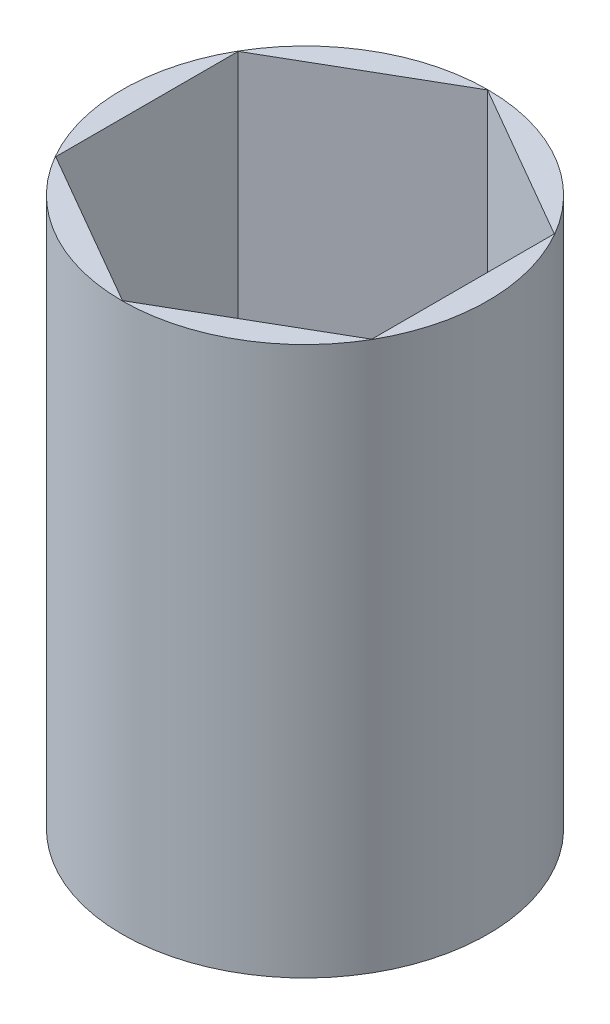
ISO-10303-21;
HEADER;
FILE_DESCRIPTION(('STEP AP214'),'2;1');
FILE_NAME('part.step','',(''),(''),'','','');
FILE_SCHEMA(('AUTOMOTIVE_DESIGN { 1 0 10303 214 1 1 1 1 }'));
ENDSEC;
DATA;
#1=APPLICATION_CONTEXT('core data for automotive mechanical design processes');
#2=APPLICATION_PROTOCOL_DEFINITION('international standard','automotive_design',2000,#1);
#3=PRODUCT_CONTEXT('',#1,'mechanical');
#4=PRODUCT('Part','Part','',(#3));
#5=PRODUCT_RELATED_PRODUCT_CATEGORY('part','',(#4));
#6=PRODUCT_DEFINITION_FORMATION('','',#4);
#7=PRODUCT_DEFINITION_CONTEXT('part definition',#1,'design');
#8=PRODUCT_DEFINITION('design','',#6,#7);
#9=PRODUCT_DEFINITION_SHAPE('','',#8);
#10=(LENGTH_UNIT() NAMED_UNIT(*) SI_UNIT(.MILLI.,.METRE.));
#11=(NAMED_UNIT(*) PLANE_ANGLE_UNIT() SI_UNIT($,.RADIAN.));
#12=(NAMED_UNIT(*) SI_UNIT($,.STERADIAN.) SOLID_ANGLE_UNIT());
#13=UNCERTAINTY_MEASURE_WITH_UNIT(LENGTH_MEASURE(1.E-05),#10,'distance_accuracy_value','');
#14=(GEOMETRIC_REPRESENTATION_CONTEXT(3) GLOBAL_UNCERTAINTY_ASSIGNED_CONTEXT((#13)) GLOBAL_UNIT_ASSIGNED_CONTEXT((#10,
#11,#12)) REPRESENTATION_CONTEXT('',''));
#15=CARTESIAN_POINT('',(0.,0.,0.));
#16=DIRECTION('',(0.,0.,1.));
#17=DIRECTION('',(1.,0.,0.));
#18=AXIS2_PLACEMENT_3D('',#15,#16,#17);
#19=CARTESIAN_POINT('',(0.,20.,0.));
#20=DIRECTION('',(0.,1.,0.));
#21=DIRECTION('',(0.,0.,1.));
#22=AXIS2_PLACEMENT_3D('',#19,#20,#21);
#23=PLANE('',#22);
#24=CARTESIAN_POINT('',(0.,20.,0.));
#25=DIRECTION('',(0.,1.,0.));
#26=DIRECTION('',(0.,0.,1.));
#27=AXIS2_PLACEMENT_3D('',#24,#25,#26);
#28=CIRCLE('',#27,7.);
#29=CARTESIAN_POINT('',(0.,20.,7.));
#30=VERTEX_POINT('',#29);
#31=EDGE_CURVE('E11',#30,#30,#28,.T.);
#32=ORIENTED_EDGE('',*,*,#31,.T.);
#33=EDGE_LOOP('',(#32));
#34=FACE_BOUND('',#33,.T.);
#35=DIRECTION('',(-0.866025403784438,0.,0.5));
#36=VECTOR('',#35,1.);
#37=CARTESIAN_POINT('',(0.,20.,-6.98593825719447));
#38=LINE('',#37,#36);
#39=CARTESIAN_POINT('',(0.,20.,-6.98593825719447));
#40=VERTEX_POINT('',#39);
#41=CARTESIAN_POINT('',(-6.05,20.,-3.49296912859724));
#42=VERTEX_POINT('',#41);
#43=EDGE_CURVE('E111',#40,#42,#38,.T.);
#44=ORIENTED_EDGE('',*,*,#43,.F.);
#45=DIRECTION('',(-0.866025403784439,0.,-0.5));
#46=VECTOR('',#45,1.);
#47=CARTESIAN_POINT('',(6.05,20.,-3.49296912859724));
#48=LINE('',#47,#46);
#49=CARTESIAN_POINT('',(6.05,20.,-3.49296912859724));
#50=VERTEX_POINT('',#49);
#51=EDGE_CURVE('E90',#50,#40,#48,.T.);
#52=ORIENTED_EDGE('',*,*,#51,.F.);
#53=DIRECTION('',(0.,0.,-1.));
#54=VECTOR('',#53,1.);
#55=CARTESIAN_POINT('',(6.05,20.,3.49296912859724));
#56=LINE('',#55,#54);
#57=CARTESIAN_POINT('',(6.05,20.,3.49296912859724));
#58=VERTEX_POINT('',#57);
#59=EDGE_CURVE('E61',#58,#50,#56,.T.);
#60=ORIENTED_EDGE('',*,*,#59,.F.);
#61=DIRECTION('',(0.866025403784439,0.,-0.5));
#62=VECTOR('',#61,1.);
#63=CARTESIAN_POINT('',(0.,20.,6.98593825719447));
#64=LINE('',#63,#62);
#65=CARTESIAN_POINT('',(0.,20.,6.98593825719447));
#66=VERTEX_POINT('',#65);
#67=EDGE_CURVE('E123',#66,#58,#64,.T.);
#68=ORIENTED_EDGE('',*,*,#67,.F.);
#69=DIRECTION('',(0.866025403784438,0.,0.5));
#70=VECTOR('',#69,1.);
#71=CARTESIAN_POINT('',(-6.05,20.,3.49296912859723));
#72=LINE('',#71,#70);
#73=CARTESIAN_POINT('',(-6.05,20.,3.49296912859723));
#74=VERTEX_POINT('',#73);
#75=EDGE_CURVE('E110',#74,#66,#72,.T.);
#76=ORIENTED_EDGE('',*,*,#75,.F.);
#77=DIRECTION('',(0.,0.,1.));
#78=VECTOR('',#77,1.);
#79=CARTESIAN_POINT('',(-6.05,20.,-3.49296912859724));
#80=LINE('',#79,#78);
#81=EDGE_CURVE('E99',#42,#74,#80,.T.);
#82=ORIENTED_EDGE('',*,*,#81,.F.);
#83=EDGE_LOOP('',(#44,#52,#60,#68,#76,#82));
#84=FACE_BOUND('',#83,.T.);
#85=ADVANCED_FACE('F39',(#34,#84),#23,.T.);
#86=CARTESIAN_POINT('',(0.,20.,0.));
#87=DIRECTION('',(0.,-1.,0.));
#88=DIRECTION('',(0.,0.,-1.));
#89=AXIS2_PLACEMENT_3D('',#86,#87,#88);
#90=CYLINDRICAL_SURFACE('',#89,7.);
#91=ORIENTED_EDGE('',*,*,#31,.F.);
#92=EDGE_LOOP('',(#91));
#93=FACE_BOUND('',#92,.T.);
#94=CARTESIAN_POINT('',(0.,-1.,0.));
#95=DIRECTION('',(0.,-1.,0.));
#96=DIRECTION('',(0.,0.,-1.));
#97=AXIS2_PLACEMENT_3D('',#94,#95,#96);
#98=CIRCLE('',#97,7.);
#99=CARTESIAN_POINT('',(0.,-1.,-7.));
#100=VERTEX_POINT('',#99);
#101=EDGE_CURVE('E138',#100,#100,#98,.T.);
#102=ORIENTED_EDGE('',*,*,#101,.F.);
#103=EDGE_LOOP('',(#102));
#104=FACE_BOUND('',#103,.T.);
#105=ADVANCED_FACE('F41',(#93,#104),#90,.T.);
#106=CARTESIAN_POINT('',(6.05,20.,-3.49296912859724));
#107=DIRECTION('',(-0.5,0.,0.866025403784439));
#108=DIRECTION('',(0.866025403784439,0.,0.5));
#109=AXIS2_PLACEMENT_3D('',#106,#107,#108);
#110=PLANE('',#109);
#111=DIRECTION('',(-0.866025403784439,0.,-0.5));
#112=VECTOR('',#111,1.);
#113=CARTESIAN_POINT('',(6.05,0.,-3.49296912859724));
#114=LINE('',#113,#112);
#115=CARTESIAN_POINT('',(6.05,0.,-3.49296912859724));
#116=VERTEX_POINT('',#115);
#117=CARTESIAN_POINT('',(0.,0.,-6.98593825719447));
#118=VERTEX_POINT('',#117);
#119=EDGE_CURVE('E133',#116,#118,#114,.T.);
#120=ORIENTED_EDGE('',*,*,#119,.F.);
#121=DIRECTION('',(0.,-1.,0.));
#122=VECTOR('',#121,1.);
#123=CARTESIAN_POINT('',(6.05,20.,-3.49296912859724));
#124=LINE('',#123,#122);
#125=EDGE_CURVE('E132',#50,#116,#124,.T.);
#126=ORIENTED_EDGE('',*,*,#125,.F.);
#127=ORIENTED_EDGE('',*,*,#51,.T.);
#128=DIRECTION('',(0.,-1.,0.));
#129=VECTOR('',#128,1.);
#130=CARTESIAN_POINT('',(0.,20.,-6.98593825719447));
#131=LINE('',#130,#129);
#132=EDGE_CURVE('E48',#40,#118,#131,.T.);
#133=ORIENTED_EDGE('',*,*,#132,.T.);
#134=EDGE_LOOP('',(#120,#126,#127,#133));
#135=FACE_BOUND('',#134,.T.);
#136=ADVANCED_FACE('F164',(#135),#110,.T.);
#137=CARTESIAN_POINT('',(0.,20.,-6.98593825719447));
#138=DIRECTION('',(0.5,0.,0.866025403784438));
#139=DIRECTION('',(0.866025403784439,0.,-0.5));
#140=AXIS2_PLACEMENT_3D('',#137,#138,#139);
#141=PLANE('',#140);
#142=DIRECTION('',(-0.866025403784438,0.,0.5));
#143=VECTOR('',#142,1.);
#144=CARTESIAN_POINT('',(0.,0.,-6.98593825719447));
#145=LINE('',#144,#143);
#146=CARTESIAN_POINT('',(-6.05,0.,-3.49296912859724));
#147=VERTEX_POINT('',#146);
#148=EDGE_CURVE('E137',#118,#147,#145,.T.);
#149=ORIENTED_EDGE('',*,*,#148,.F.);
#150=ORIENTED_EDGE('',*,*,#132,.F.);
#151=ORIENTED_EDGE('',*,*,#43,.T.);
#152=DIRECTION('',(0.,-1.,0.));
#153=VECTOR('',#152,1.);
#154=CARTESIAN_POINT('',(-6.05,20.,-3.49296912859724));
#155=LINE('',#154,#153);
#156=EDGE_CURVE('E105',#42,#147,#155,.T.);
#157=ORIENTED_EDGE('',*,*,#156,.T.);
#158=EDGE_LOOP('',(#149,#150,#151,#157));
#159=FACE_BOUND('',#158,.T.);
#160=ADVANCED_FACE('F208',(#159),#141,.T.);
#161=CARTESIAN_POINT('',(-6.05,20.,-3.49296912859724));
#162=DIRECTION('',(1.,0.,0.));
#163=DIRECTION('',(0.,0.,-1.));
#164=AXIS2_PLACEMENT_3D('',#161,#162,#163);
#165=PLANE('',#164);
#166=DIRECTION('',(0.,0.,1.));
#167=VECTOR('',#166,1.);
#168=CARTESIAN_POINT('',(-6.05,0.,-3.49296912859724));
#169=LINE('',#168,#167);
#170=CARTESIAN_POINT('',(-6.05,0.,3.49296912859723));
#171=VERTEX_POINT('',#170);
#172=EDGE_CURVE('E142',#147,#171,#169,.T.);
#173=ORIENTED_EDGE('',*,*,#172,.F.);
#174=ORIENTED_EDGE('',*,*,#156,.F.);
#175=ORIENTED_EDGE('',*,*,#81,.T.);
#176=DIRECTION('',(0.,-1.,0.));
#177=VECTOR('',#176,1.);
#178=CARTESIAN_POINT('',(-6.05,20.,3.49296912859723));
#179=LINE('',#178,#177);
#180=EDGE_CURVE('E103',#74,#171,#179,.T.);
#181=ORIENTED_EDGE('',*,*,#180,.T.);
#182=EDGE_LOOP('',(#173,#174,#175,#181));
#183=FACE_BOUND('',#182,.T.);
#184=ADVANCED_FACE('F102',(#183),#165,.T.);
#185=CARTESIAN_POINT('',(-6.05,20.,3.49296912859723));
#186=DIRECTION('',(0.5,0.,-0.866025403784439));
#187=DIRECTION('',(-0.866025403784439,0.,-0.5));
#188=AXIS2_PLACEMENT_3D('',#185,#186,#187);
#189=PLANE('',#188);
#190=DIRECTION('',(0.866025403784438,0.,0.5));
#191=VECTOR('',#190,1.);
#192=CARTESIAN_POINT('',(-6.05,0.,3.49296912859723));
#193=LINE('',#192,#191);
#194=CARTESIAN_POINT('',(0.,0.,6.98593825719447));
#195=VERTEX_POINT('',#194);
#196=EDGE_CURVE('E117',#171,#195,#193,.T.);
#197=ORIENTED_EDGE('',*,*,#196,.F.);
#198=ORIENTED_EDGE('',*,*,#180,.F.);
#199=ORIENTED_EDGE('',*,*,#75,.T.);
#200=DIRECTION('',(0.,-1.,0.));
#201=VECTOR('',#200,1.);
#202=CARTESIAN_POINT('',(0.,20.,6.98593825719447));
#203=LINE('',#202,#201);
#204=EDGE_CURVE('E120',#66,#195,#203,.T.);
#205=ORIENTED_EDGE('',*,*,#204,.T.);
#206=EDGE_LOOP('',(#197,#198,#199,#205));
#207=FACE_BOUND('',#206,.T.);
#208=ADVANCED_FACE('F114',(#207),#189,.T.);
#209=CARTESIAN_POINT('',(0.,20.,6.98593825719447));
#210=DIRECTION('',(-0.5,0.,-0.866025403784439));
#211=DIRECTION('',(-0.866025403784439,0.,0.5));
#212=AXIS2_PLACEMENT_3D('',#209,#210,#211);
#213=PLANE('',#212);
#214=DIRECTION('',(0.866025403784439,0.,-0.5));
#215=VECTOR('',#214,1.);
#216=CARTESIAN_POINT('',(0.,0.,6.98593825719447));
#217=LINE('',#216,#215);
#218=CARTESIAN_POINT('',(6.05,0.,3.49296912859724));
#219=VERTEX_POINT('',#218);
#220=EDGE_CURVE('E147',#195,#219,#217,.T.);
#221=ORIENTED_EDGE('',*,*,#220,.F.);
#222=ORIENTED_EDGE('',*,*,#204,.F.);
#223=ORIENTED_EDGE('',*,*,#67,.T.);
#224=DIRECTION('',(0.,-1.,0.));
#225=VECTOR('',#224,1.);
#226=CARTESIAN_POINT('',(6.05,20.,3.49296912859724));
#227=LINE('',#226,#225);
#228=EDGE_CURVE('E55',#58,#219,#227,.T.);
#229=ORIENTED_EDGE('',*,*,#228,.T.);
#230=EDGE_LOOP('',(#221,#222,#223,#229));
#231=FACE_BOUND('',#230,.T.);
#232=ADVANCED_FACE('F215',(#231),#213,.T.);
#233=CARTESIAN_POINT('',(6.05,20.,3.49296912859724));
#234=DIRECTION('',(-1.,0.,0.));
#235=DIRECTION('',(0.,0.,1.));
#236=AXIS2_PLACEMENT_3D('',#233,#234,#235);
#237=PLANE('',#236);
#238=DIRECTION('',(0.,0.,-1.));
#239=VECTOR('',#238,1.);
#240=CARTESIAN_POINT('',(6.05,0.,3.49296912859724));
#241=LINE('',#240,#239);
#242=EDGE_CURVE('E151',#219,#116,#241,.T.);
#243=ORIENTED_EDGE('',*,*,#242,.F.);
#244=ORIENTED_EDGE('',*,*,#228,.F.);
#245=ORIENTED_EDGE('',*,*,#59,.T.);
#246=ORIENTED_EDGE('',*,*,#125,.T.);
#247=EDGE_LOOP('',(#243,#244,#245,#246));
#248=FACE_BOUND('',#247,.T.);
#249=ADVANCED_FACE('F168',(#248),#237,.T.);
#250=CARTESIAN_POINT('',(0.,0.,0.));
#251=DIRECTION('',(0.,-1.,0.));
#252=DIRECTION('',(0.,0.,-1.));
#253=AXIS2_PLACEMENT_3D('',#250,#251,#252);
#254=PLANE('',#253);
#255=CARTESIAN_POINT('',(0.,0.,0.));
#256=DIRECTION('',(0.,-1.,0.));
#257=DIRECTION('',(0.,0.,-1.));
#258=AXIS2_PLACEMENT_3D('',#255,#256,#257);
#259=CIRCLE('',#258,2.05);
#260=CARTESIAN_POINT('',(0.,0.,-2.05));
#261=VERTEX_POINT('',#260);
#262=EDGE_CURVE('E177',#261,#261,#259,.T.);
#263=ORIENTED_EDGE('',*,*,#262,.T.);
#264=EDGE_LOOP('',(#263));
#265=FACE_BOUND('',#264,.T.);
#266=ORIENTED_EDGE('',*,*,#242,.T.);
#267=ORIENTED_EDGE('',*,*,#119,.T.);
#268=ORIENTED_EDGE('',*,*,#148,.T.);
#269=ORIENTED_EDGE('',*,*,#172,.T.);
#270=ORIENTED_EDGE('',*,*,#196,.T.);
#271=ORIENTED_EDGE('',*,*,#220,.T.);
#272=EDGE_LOOP('',(#266,#267,#268,#269,#270,#271));
#273=FACE_BOUND('',#272,.T.);
#274=ADVANCED_FACE('F167',(#265,#273),#254,.F.);
#275=CARTESIAN_POINT('',(0.,-1.,0.));
#276=DIRECTION('',(0.,-1.,0.));
#277=DIRECTION('',(0.,0.,-1.));
#278=AXIS2_PLACEMENT_3D('',#275,#276,#277);
#279=PLANE('',#278);
#280=ORIENTED_EDGE('',*,*,#101,.T.);
#281=EDGE_LOOP('',(#280));
#282=FACE_BOUND('',#281,.T.);
#283=CARTESIAN_POINT('',(0.,-1.,0.));
#284=DIRECTION('',(0.,-1.,0.));
#285=DIRECTION('',(0.,0.,-1.));
#286=AXIS2_PLACEMENT_3D('',#283,#284,#285);
#287=CIRCLE('',#286,2.05);
#288=CARTESIAN_POINT('',(0.,-1.,-2.05));
#289=VERTEX_POINT('',#288);
#290=EDGE_CURVE('E176',#289,#289,#287,.T.);
#291=ORIENTED_EDGE('',*,*,#290,.F.);
#292=EDGE_LOOP('',(#291));
#293=FACE_BOUND('',#292,.T.);
#294=ADVANCED_FACE('F188',(#282,#293),#279,.T.);
#295=CARTESIAN_POINT('',(0.,-1.,0.));
#296=DIRECTION('',(0.,1.,0.));
#297=DIRECTION('',(0.,0.,1.));
#298=AXIS2_PLACEMENT_3D('',#295,#296,#297);
#299=CYLINDRICAL_SURFACE('',#298,2.05);
#300=ORIENTED_EDGE('',*,*,#290,.T.);
#301=EDGE_LOOP('',(#300));
#302=FACE_BOUND('',#301,.T.);
#303=ORIENTED_EDGE('',*,*,#262,.F.);
#304=EDGE_LOOP('',(#303));
#305=FACE_BOUND('',#304,.T.);
#306=ADVANCED_FACE('F185',(#302,#305),#299,.F.);
#307=CLOSED_SHELL('',(#85,#105,#136,#160,#184,#208,#232,#249,#274,#294,#306));
#308=MANIFOLD_SOLID_BREP('B2',#307);
#309=ADVANCED_BREP_SHAPE_REPRESENTATION('',(#18,#308),#14);
#310=SHAPE_DEFINITION_REPRESENTATION(#9,#309);
ENDSEC;
END-ISO-10303-21;
